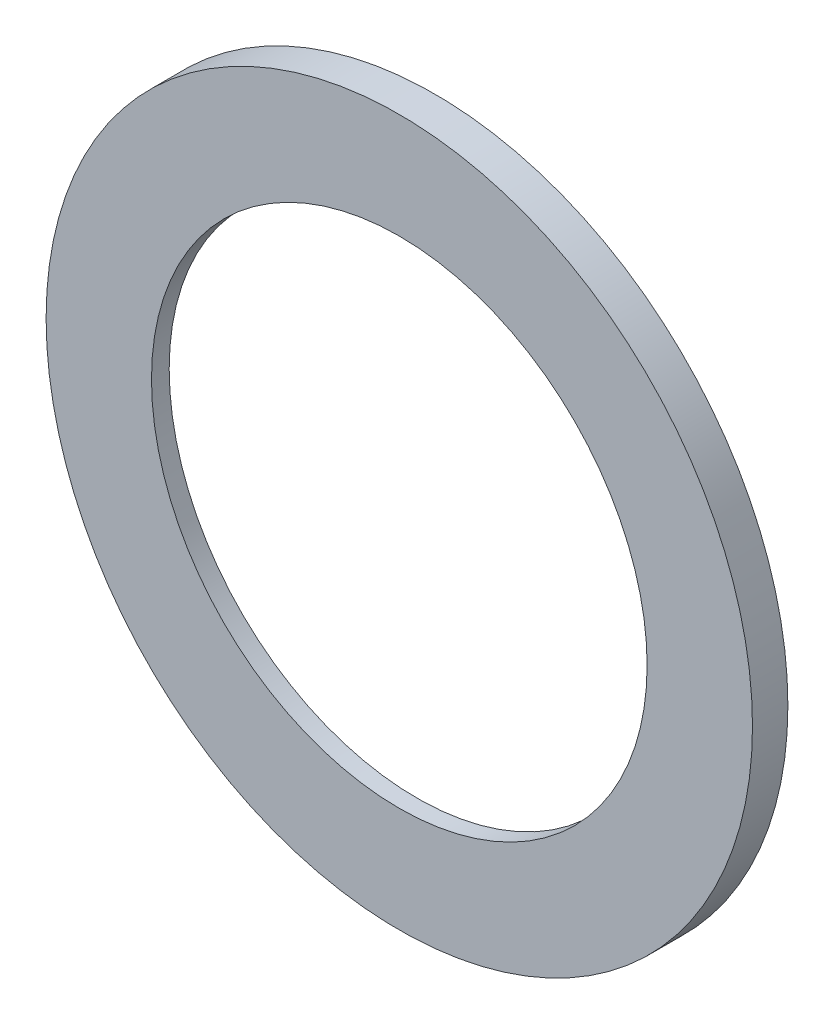
ISO-10303-21;
HEADER;
FILE_DESCRIPTION(('STEP AP214'),'2;1');
FILE_NAME('part.step','',(''),(''),'','','');
FILE_SCHEMA(('AUTOMOTIVE_DESIGN { 1 0 10303 214 1 1 1 1 }'));
ENDSEC;
DATA;
#1=APPLICATION_CONTEXT('core data for automotive mechanical design processes');
#2=APPLICATION_PROTOCOL_DEFINITION('international standard','automotive_design',2000,#1);
#3=PRODUCT_CONTEXT('',#1,'mechanical');
#4=PRODUCT('Part','Part','',(#3));
#5=PRODUCT_RELATED_PRODUCT_CATEGORY('part','',(#4));
#6=PRODUCT_DEFINITION_FORMATION('','',#4);
#7=PRODUCT_DEFINITION_CONTEXT('part definition',#1,'design');
#8=PRODUCT_DEFINITION('design','',#6,#7);
#9=PRODUCT_DEFINITION_SHAPE('','',#8);
#10=(LENGTH_UNIT() NAMED_UNIT(*) SI_UNIT(.MILLI.,.METRE.));
#11=(NAMED_UNIT(*) PLANE_ANGLE_UNIT() SI_UNIT($,.RADIAN.));
#12=(NAMED_UNIT(*) SI_UNIT($,.STERADIAN.) SOLID_ANGLE_UNIT());
#13=UNCERTAINTY_MEASURE_WITH_UNIT(LENGTH_MEASURE(1.E-05),#10,'distance_accuracy_value','');
#14=(GEOMETRIC_REPRESENTATION_CONTEXT(3) GLOBAL_UNCERTAINTY_ASSIGNED_CONTEXT((#13)) GLOBAL_UNIT_ASSIGNED_CONTEXT((#10,
#11,#12)) REPRESENTATION_CONTEXT('',''));
#15=CARTESIAN_POINT('',(0.,0.,0.));
#16=DIRECTION('',(0.,0.,1.));
#17=DIRECTION('',(1.,0.,0.));
#18=AXIS2_PLACEMENT_3D('',#15,#16,#17);
#19=CARTESIAN_POINT('',(92.2854942236277,47.625,20.33));
#20=DIRECTION('',(0.,0.,-1.));
#21=DIRECTION('',(-1.,0.,0.));
#22=AXIS2_PLACEMENT_3D('',#19,#20,#21);
#23=CYLINDRICAL_SURFACE('',#22,17.78);
#24=CARTESIAN_POINT('',(92.2854942236277,47.625,19.05));
#25=DIRECTION('',(0.,0.,1.));
#26=DIRECTION('',(1.,0.,0.));
#27=AXIS2_PLACEMENT_3D('',#24,#25,#26);
#28=CIRCLE('',#27,17.78);
#29=CARTESIAN_POINT('',(110.065494223628,47.625,19.05));
#30=VERTEX_POINT('',#29);
#31=EDGE_CURVE('E38',#30,#30,#28,.T.);
#32=ORIENTED_EDGE('',*,*,#31,.T.);
#33=EDGE_LOOP('',(#32));
#34=FACE_BOUND('',#33,.T.);
#35=CARTESIAN_POINT('',(92.2854942236277,47.625,17.78));
#36=DIRECTION('',(0.,0.,-1.));
#37=DIRECTION('',(-1.,0.,0.));
#38=AXIS2_PLACEMENT_3D('',#35,#36,#37);
#39=CIRCLE('',#38,17.78);
#40=CARTESIAN_POINT('',(74.5054942236277,47.625,17.78));
#41=VERTEX_POINT('',#40);
#42=EDGE_CURVE('E10',#41,#41,#39,.T.);
#43=ORIENTED_EDGE('',*,*,#42,.T.);
#44=EDGE_LOOP('',(#43));
#45=FACE_BOUND('',#44,.T.);
#46=ADVANCED_FACE('F35',(#34,#45),#23,.F.);
#47=CARTESIAN_POINT('',(92.2854942236277,47.625,16.51));
#48=DIRECTION('',(0.,0.,1.));
#49=DIRECTION('',(1.,0.,0.));
#50=AXIS2_PLACEMENT_3D('',#47,#48,#49);
#51=PLANE('',#50);
#52=CARTESIAN_POINT('',(92.2854942236277,47.625,16.51));
#53=DIRECTION('',(0.,0.,-1.));
#54=DIRECTION('',(-1.,0.,0.));
#55=AXIS2_PLACEMENT_3D('',#52,#53,#54);
#56=CIRCLE('',#55,23.495);
#57=CARTESIAN_POINT('',(68.7904942236277,47.625,16.51));
#58=VERTEX_POINT('',#57);
#59=EDGE_CURVE('E53',#58,#58,#56,.T.);
#60=ORIENTED_EDGE('',*,*,#59,.F.);
#61=EDGE_LOOP('',(#60));
#62=FACE_BOUND('',#61,.T.);
#63=CARTESIAN_POINT('',(92.2854942236277,47.625,16.51));
#64=DIRECTION('',(0.,0.,1.));
#65=DIRECTION('',(1.,0.,0.));
#66=AXIS2_PLACEMENT_3D('',#63,#64,#65);
#67=CIRCLE('',#66,25.3400809587943);
#68=CARTESIAN_POINT('',(117.625575182422,47.625,16.51));
#69=VERTEX_POINT('',#68);
#70=EDGE_CURVE('E45',#69,#69,#67,.T.);
#71=ORIENTED_EDGE('',*,*,#70,.F.);
#72=EDGE_LOOP('',(#71));
#73=FACE_BOUND('',#72,.T.);
#74=ADVANCED_FACE('F64',(#62,#73),#51,.F.);
#75=CARTESIAN_POINT('',(92.2854942236277,47.625,17.78));
#76=DIRECTION('',(0.,0.,-1.));
#77=DIRECTION('',(-1.,0.,0.));
#78=AXIS2_PLACEMENT_3D('',#75,#76,#77);
#79=CYLINDRICAL_SURFACE('',#78,23.495);
#80=CARTESIAN_POINT('',(92.2854942236277,47.625,17.78));
#81=DIRECTION('',(0.,0.,-1.));
#82=DIRECTION('',(-1.,0.,0.));
#83=AXIS2_PLACEMENT_3D('',#80,#81,#82);
#84=CIRCLE('',#83,23.495);
#85=CARTESIAN_POINT('',(68.7904942236277,47.625,17.78));
#86=VERTEX_POINT('',#85);
#87=EDGE_CURVE('E50',#86,#86,#84,.T.);
#88=ORIENTED_EDGE('',*,*,#87,.F.);
#89=EDGE_LOOP('',(#88));
#90=FACE_BOUND('',#89,.T.);
#91=ORIENTED_EDGE('',*,*,#59,.T.);
#92=EDGE_LOOP('',(#91));
#93=FACE_BOUND('',#92,.T.);
#94=ADVANCED_FACE('F61',(#90,#93),#79,.F.);
#95=CARTESIAN_POINT('',(0.,0.,17.78));
#96=DIRECTION('',(0.,0.,-1.));
#97=DIRECTION('',(-1.,0.,0.));
#98=AXIS2_PLACEMENT_3D('',#95,#96,#97);
#99=PLANE('',#98);
#100=ORIENTED_EDGE('',*,*,#42,.F.);
#101=EDGE_LOOP('',(#100));
#102=FACE_BOUND('',#101,.T.);
#103=ORIENTED_EDGE('',*,*,#87,.T.);
#104=EDGE_LOOP('',(#103));
#105=FACE_BOUND('',#104,.T.);
#106=ADVANCED_FACE('F59',(#102,#105),#99,.T.);
#107=CARTESIAN_POINT('',(92.2854942236277,47.625,16.51));
#108=DIRECTION('',(0.,0.,1.));
#109=DIRECTION('',(1.,0.,0.));
#110=AXIS2_PLACEMENT_3D('',#107,#108,#109);
#111=CYLINDRICAL_SURFACE('',#110,25.3400809587943);
#112=ORIENTED_EDGE('',*,*,#70,.T.);
#113=EDGE_LOOP('',(#112));
#114=FACE_BOUND('',#113,.T.);
#115=CARTESIAN_POINT('',(92.2854942236277,47.625,19.05));
#116=DIRECTION('',(0.,0.,1.));
#117=DIRECTION('',(1.,0.,0.));
#118=AXIS2_PLACEMENT_3D('',#115,#116,#117);
#119=CIRCLE('',#118,25.3400809587943);
#120=CARTESIAN_POINT('',(117.625575182422,47.625,19.05));
#121=VERTEX_POINT('',#120);
#122=EDGE_CURVE('E47',#121,#121,#119,.T.);
#123=ORIENTED_EDGE('',*,*,#122,.F.);
#124=EDGE_LOOP('',(#123));
#125=FACE_BOUND('',#124,.T.);
#126=ADVANCED_FACE('F73',(#114,#125),#111,.T.);
#127=CARTESIAN_POINT('',(92.2854942236277,47.625,19.05));
#128=DIRECTION('',(0.,0.,1.));
#129=DIRECTION('',(1.,0.,0.));
#130=AXIS2_PLACEMENT_3D('',#127,#128,#129);
#131=PLANE('',#130);
#132=ORIENTED_EDGE('',*,*,#31,.F.);
#133=EDGE_LOOP('',(#132));
#134=FACE_BOUND('',#133,.T.);
#135=ORIENTED_EDGE('',*,*,#122,.T.);
#136=EDGE_LOOP('',(#135));
#137=FACE_BOUND('',#136,.T.);
#138=ADVANCED_FACE('F76',(#134,#137),#131,.T.);
#139=CLOSED_SHELL('',(#46,#74,#94,#106,#126,#138));
#140=MANIFOLD_SOLID_BREP('B2',#139);
#141=ADVANCED_BREP_SHAPE_REPRESENTATION('',(#18,#140),#14);
#142=SHAPE_DEFINITION_REPRESENTATION(#9,#141);
ENDSEC;
END-ISO-10303-21;
